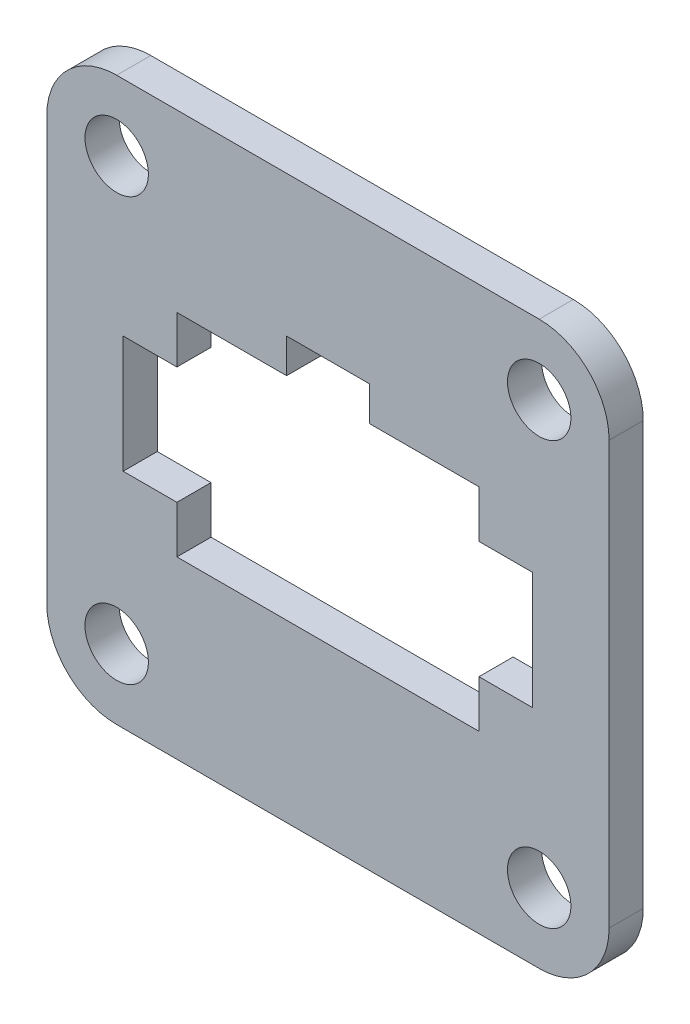
ISO-10303-21;
HEADER;
FILE_DESCRIPTION(('STEP AP214'),'2;1');
FILE_NAME('part.step','',(''),(''),'','','');
FILE_SCHEMA(('AUTOMOTIVE_DESIGN { 1 0 10303 214 1 1 1 1 }'));
ENDSEC;
DATA;
#1=APPLICATION_CONTEXT('core data for automotive mechanical design processes');
#2=APPLICATION_PROTOCOL_DEFINITION('international standard','automotive_design',2000,#1);
#3=PRODUCT_CONTEXT('',#1,'mechanical');
#4=PRODUCT('Part','Part','',(#3));
#5=PRODUCT_RELATED_PRODUCT_CATEGORY('part','',(#4));
#6=PRODUCT_DEFINITION_FORMATION('','',#4);
#7=PRODUCT_DEFINITION_CONTEXT('part definition',#1,'design');
#8=PRODUCT_DEFINITION('design','',#6,#7);
#9=PRODUCT_DEFINITION_SHAPE('','',#8);
#10=(LENGTH_UNIT() NAMED_UNIT(*) SI_UNIT(.MILLI.,.METRE.));
#11=(NAMED_UNIT(*) PLANE_ANGLE_UNIT() SI_UNIT($,.RADIAN.));
#12=(NAMED_UNIT(*) SI_UNIT($,.STERADIAN.) SOLID_ANGLE_UNIT());
#13=UNCERTAINTY_MEASURE_WITH_UNIT(LENGTH_MEASURE(1.E-05),#10,'distance_accuracy_value','');
#14=(GEOMETRIC_REPRESENTATION_CONTEXT(3) GLOBAL_UNCERTAINTY_ASSIGNED_CONTEXT((#13)) GLOBAL_UNIT_ASSIGNED_CONTEXT((#10,
#11,#12)) REPRESENTATION_CONTEXT('',''));
#15=CARTESIAN_POINT('',(0.,0.,0.));
#16=DIRECTION('',(0.,0.,1.));
#17=DIRECTION('',(1.,0.,0.));
#18=AXIS2_PLACEMENT_3D('',#15,#16,#17);
#19=CARTESIAN_POINT('',(-0.0762,0.,1.5875));
#20=DIRECTION('',(1.,0.,0.));
#21=DIRECTION('',(0.,0.,-1.));
#22=AXIS2_PLACEMENT_3D('',#19,#20,#21);
#23=PLANE('',#22);
#24=DIRECTION('',(0.,-1.,0.));
#25=VECTOR('',#24,1.);
#26=CARTESIAN_POINT('',(-0.0762,0.,0.));
#27=LINE('',#26,#25);
#28=CARTESIAN_POINT('',(-0.0762000000000002,22.825,0.));
#29=VERTEX_POINT('',#28);
#30=CARTESIAN_POINT('',(-0.0762,3.175,0.));
#31=VERTEX_POINT('',#30);
#32=EDGE_CURVE('E366',#29,#31,#27,.T.);
#33=ORIENTED_EDGE('',*,*,#32,.T.);
#34=DIRECTION('',(0.,0.,-1.));
#35=VECTOR('',#34,1.);
#36=CARTESIAN_POINT('',(-0.0762,3.175,1.5875));
#37=LINE('',#36,#35);
#38=CARTESIAN_POINT('',(-0.0762,3.175,1.5875));
#39=VERTEX_POINT('',#38);
#40=EDGE_CURVE('E298',#31,#39,#37,.F.);
#41=ORIENTED_EDGE('',*,*,#40,.T.);
#42=DIRECTION('',(0.,-1.,0.));
#43=VECTOR('',#42,1.);
#44=CARTESIAN_POINT('',(-0.0762,0.,1.5875));
#45=LINE('',#44,#43);
#46=CARTESIAN_POINT('',(-0.0762,22.825,1.5875));
#47=VERTEX_POINT('',#46);
#48=EDGE_CURVE('E280',#47,#39,#45,.T.);
#49=ORIENTED_EDGE('',*,*,#48,.F.);
#50=DIRECTION('',(0.,0.,-1.));
#51=VECTOR('',#50,1.);
#52=CARTESIAN_POINT('',(-0.0762,22.825,1.5875));
#53=LINE('',#52,#51);
#54=EDGE_CURVE('E336',#47,#29,#53,.T.);
#55=ORIENTED_EDGE('',*,*,#54,.T.);
#56=EDGE_LOOP('',(#33,#41,#49,#55));
#57=FACE_BOUND('',#56,.T.);
#58=ADVANCED_FACE('F38',(#57),#23,.F.);
#59=CARTESIAN_POINT('',(0.,-0.0762,1.5875));
#60=DIRECTION('',(0.,1.,0.));
#61=DIRECTION('',(0.,0.,1.));
#62=AXIS2_PLACEMENT_3D('',#59,#60,#61);
#63=PLANE('',#62);
#64=DIRECTION('',(1.,0.,0.));
#65=VECTOR('',#64,1.);
#66=CARTESIAN_POINT('',(0.,-0.0762,1.5875));
#67=LINE('',#66,#65);
#68=CARTESIAN_POINT('',(3.175,-0.0762,1.5875));
#69=VERTEX_POINT('',#68);
#70=CARTESIAN_POINT('',(22.825,-0.0762,1.5875));
#71=VERTEX_POINT('',#70);
#72=EDGE_CURVE('E291',#69,#71,#67,.T.);
#73=ORIENTED_EDGE('',*,*,#72,.F.);
#74=DIRECTION('',(0.,0.,1.));
#75=VECTOR('',#74,1.);
#76=CARTESIAN_POINT('',(3.175,-0.0762,1.5875));
#77=LINE('',#76,#75);
#78=CARTESIAN_POINT('',(3.175,-0.0762000000000002,0.));
#79=VERTEX_POINT('',#78);
#80=EDGE_CURVE('E300',#69,#79,#77,.F.);
#81=ORIENTED_EDGE('',*,*,#80,.T.);
#82=DIRECTION('',(1.,0.,0.));
#83=VECTOR('',#82,1.);
#84=CARTESIAN_POINT('',(0.,-0.0762,0.));
#85=LINE('',#84,#83);
#86=CARTESIAN_POINT('',(22.825,-0.0762,0.));
#87=VERTEX_POINT('',#86);
#88=EDGE_CURVE('E363',#79,#87,#85,.T.);
#89=ORIENTED_EDGE('',*,*,#88,.T.);
#90=DIRECTION('',(0.,0.,1.));
#91=VECTOR('',#90,1.);
#92=CARTESIAN_POINT('',(22.825,-0.0762,1.5875));
#93=LINE('',#92,#91);
#94=EDGE_CURVE('E334',#87,#71,#93,.T.);
#95=ORIENTED_EDGE('',*,*,#94,.T.);
#96=EDGE_LOOP('',(#73,#81,#89,#95));
#97=FACE_BOUND('',#96,.T.);
#98=ADVANCED_FACE('F529',(#97),#63,.F.);
#99=CARTESIAN_POINT('',(26.0762,0.,1.5875));
#100=DIRECTION('',(-1.,0.,0.));
#101=DIRECTION('',(0.,0.,1.));
#102=AXIS2_PLACEMENT_3D('',#99,#100,#101);
#103=PLANE('',#102);
#104=DIRECTION('',(0.,1.,0.));
#105=VECTOR('',#104,1.);
#106=CARTESIAN_POINT('',(26.0762,0.,1.5875));
#107=LINE('',#106,#105);
#108=CARTESIAN_POINT('',(26.0762,3.175,1.5875));
#109=VERTEX_POINT('',#108);
#110=CARTESIAN_POINT('',(26.0762,22.825,1.5875));
#111=VERTEX_POINT('',#110);
#112=EDGE_CURVE('E318',#109,#111,#107,.T.);
#113=ORIENTED_EDGE('',*,*,#112,.F.);
#114=DIRECTION('',(0.,0.,1.));
#115=VECTOR('',#114,1.);
#116=CARTESIAN_POINT('',(26.0762,3.175,1.5875));
#117=LINE('',#116,#115);
#118=CARTESIAN_POINT('',(26.0762,3.175,0.));
#119=VERTEX_POINT('',#118);
#120=EDGE_CURVE('E307',#109,#119,#117,.F.);
#121=ORIENTED_EDGE('',*,*,#120,.T.);
#122=DIRECTION('',(0.,1.,0.));
#123=VECTOR('',#122,1.);
#124=CARTESIAN_POINT('',(26.0762,0.,0.));
#125=LINE('',#124,#123);
#126=CARTESIAN_POINT('',(26.0762,22.825,0.));
#127=VERTEX_POINT('',#126);
#128=EDGE_CURVE('E358',#119,#127,#125,.T.);
#129=ORIENTED_EDGE('',*,*,#128,.T.);
#130=DIRECTION('',(0.,0.,1.));
#131=VECTOR('',#130,1.);
#132=CARTESIAN_POINT('',(26.0762,22.825,1.5875));
#133=LINE('',#132,#131);
#134=EDGE_CURVE('E302',#127,#111,#133,.T.);
#135=ORIENTED_EDGE('',*,*,#134,.T.);
#136=EDGE_LOOP('',(#113,#121,#129,#135));
#137=FACE_BOUND('',#136,.T.);
#138=ADVANCED_FACE('F357',(#137),#103,.F.);
#139=CARTESIAN_POINT('',(0.,26.0762,1.5875));
#140=DIRECTION('',(0.,-1.,0.));
#141=DIRECTION('',(0.,0.,-1.));
#142=AXIS2_PLACEMENT_3D('',#139,#140,#141);
#143=PLANE('',#142);
#144=DIRECTION('',(-1.,0.,0.));
#145=VECTOR('',#144,1.);
#146=CARTESIAN_POINT('',(0.,26.0762,1.5875));
#147=LINE('',#146,#145);
#148=CARTESIAN_POINT('',(22.825,26.0762,1.5875));
#149=VERTEX_POINT('',#148);
#150=CARTESIAN_POINT('',(3.175,26.0762,1.5875));
#151=VERTEX_POINT('',#150);
#152=EDGE_CURVE('E329',#149,#151,#147,.T.);
#153=ORIENTED_EDGE('',*,*,#152,.F.);
#154=DIRECTION('',(0.,0.,-1.));
#155=VECTOR('',#154,1.);
#156=CARTESIAN_POINT('',(22.825,26.0762,1.5875));
#157=LINE('',#156,#155);
#158=CARTESIAN_POINT('',(22.825,26.0762,0.));
#159=VERTEX_POINT('',#158);
#160=EDGE_CURVE('E13',#149,#159,#157,.T.);
#161=ORIENTED_EDGE('',*,*,#160,.T.);
#162=DIRECTION('',(-1.,0.,0.));
#163=VECTOR('',#162,1.);
#164=CARTESIAN_POINT('',(0.,26.0762,0.));
#165=LINE('',#164,#163);
#166=CARTESIAN_POINT('',(3.175,26.0762,0.));
#167=VERTEX_POINT('',#166);
#168=EDGE_CURVE('E292',#159,#167,#165,.T.);
#169=ORIENTED_EDGE('',*,*,#168,.T.);
#170=DIRECTION('',(0.,0.,-1.));
#171=VECTOR('',#170,1.);
#172=CARTESIAN_POINT('',(3.175,26.0762,1.5875));
#173=LINE('',#172,#171);
#174=EDGE_CURVE('E48',#167,#151,#173,.F.);
#175=ORIENTED_EDGE('',*,*,#174,.T.);
#176=EDGE_LOOP('',(#153,#161,#169,#175));
#177=FACE_BOUND('',#176,.T.);
#178=ADVANCED_FACE('F264',(#177),#143,.F.);
#179=CARTESIAN_POINT('',(0.,0.,1.5875));
#180=DIRECTION('',(0.,0.,-1.));
#181=DIRECTION('',(-1.,0.,0.));
#182=AXIS2_PLACEMENT_3D('',#179,#180,#181);
#183=PLANE('',#182);
#184=CARTESIAN_POINT('',(3.175,3.175,1.5875));
#185=DIRECTION('',(0.,0.,-1.));
#186=DIRECTION('',(-1.,0.,0.));
#187=AXIS2_PLACEMENT_3D('',#184,#185,#186);
#188=CIRCLE('',#187,1.4738);
#189=CARTESIAN_POINT('',(1.7012,3.175,1.5875));
#190=VERTEX_POINT('',#189);
#191=EDGE_CURVE('E42',#190,#190,#188,.F.);
#192=ORIENTED_EDGE('',*,*,#191,.F.);
#193=EDGE_LOOP('',(#192));
#194=FACE_BOUND('',#193,.T.);
#195=CARTESIAN_POINT('',(22.825,3.175,1.5875));
#196=DIRECTION('',(0.,0.,-1.));
#197=DIRECTION('',(-1.,0.,0.));
#198=AXIS2_PLACEMENT_3D('',#195,#196,#197);
#199=CIRCLE('',#198,1.4738);
#200=CARTESIAN_POINT('',(21.3512,3.175,1.5875));
#201=VERTEX_POINT('',#200);
#202=EDGE_CURVE('E234',#201,#201,#199,.F.);
#203=ORIENTED_EDGE('',*,*,#202,.F.);
#204=EDGE_LOOP('',(#203));
#205=FACE_BOUND('',#204,.T.);
#206=CARTESIAN_POINT('',(22.825,22.825,1.5875));
#207=DIRECTION('',(0.,0.,-1.));
#208=DIRECTION('',(-1.,0.,0.));
#209=AXIS2_PLACEMENT_3D('',#206,#207,#208);
#210=CIRCLE('',#209,1.4738);
#211=CARTESIAN_POINT('',(21.3512,22.825,1.5875));
#212=VERTEX_POINT('',#211);
#213=EDGE_CURVE('E233',#212,#212,#210,.F.);
#214=ORIENTED_EDGE('',*,*,#213,.F.);
#215=EDGE_LOOP('',(#214));
#216=FACE_BOUND('',#215,.T.);
#217=CARTESIAN_POINT('',(3.175,22.825,1.5875));
#218=DIRECTION('',(0.,0.,-1.));
#219=DIRECTION('',(-1.,0.,0.));
#220=AXIS2_PLACEMENT_3D('',#217,#218,#219);
#221=CIRCLE('',#220,1.4738);
#222=CARTESIAN_POINT('',(1.7012,22.825,1.5875));
#223=VERTEX_POINT('',#222);
#224=EDGE_CURVE('E242',#223,#223,#221,.F.);
#225=ORIENTED_EDGE('',*,*,#224,.F.);
#226=EDGE_LOOP('',(#225));
#227=FACE_BOUND('',#226,.T.);
#228=DIRECTION('',(0.,-1.,0.));
#229=VECTOR('',#228,1.);
#230=CARTESIAN_POINT('',(5.9762,15.8,1.5875));
#231=LINE('',#230,#229);
#232=CARTESIAN_POINT('',(5.9762,17.9238,1.5875));
#233=VERTEX_POINT('',#232);
#234=CARTESIAN_POINT('',(5.9762,15.7238,1.5875));
#235=VERTEX_POINT('',#234);
#236=EDGE_CURVE('E277',#233,#235,#231,.T.);
#237=ORIENTED_EDGE('',*,*,#236,.F.);
#238=DIRECTION('',(-1.,0.,0.));
#239=VECTOR('',#238,1.);
#240=CARTESIAN_POINT('',(5.9,17.9238,1.5875));
#241=LINE('',#240,#239);
#242=CARTESIAN_POINT('',(11.0762,17.9238,1.5875));
#243=VERTEX_POINT('',#242);
#244=EDGE_CURVE('E249',#243,#233,#241,.T.);
#245=ORIENTED_EDGE('',*,*,#244,.F.);
#246=DIRECTION('',(0.,-1.,0.));
#247=VECTOR('',#246,1.);
#248=CARTESIAN_POINT('',(11.0762,18.,1.5875));
#249=LINE('',#248,#247);
#250=CARTESIAN_POINT('',(11.0762,19.5238,1.5875));
#251=VERTEX_POINT('',#250);
#252=EDGE_CURVE('E448',#251,#243,#249,.T.);
#253=ORIENTED_EDGE('',*,*,#252,.F.);
#254=DIRECTION('',(-1.,0.,0.));
#255=VECTOR('',#254,1.);
#256=CARTESIAN_POINT('',(11.,19.5238,1.5875));
#257=LINE('',#256,#255);
#258=CARTESIAN_POINT('',(14.9238,19.5238,1.5875));
#259=VERTEX_POINT('',#258);
#260=EDGE_CURVE('E453',#259,#251,#257,.T.);
#261=ORIENTED_EDGE('',*,*,#260,.F.);
#262=DIRECTION('',(0.,1.,0.));
#263=VECTOR('',#262,1.);
#264=CARTESIAN_POINT('',(14.9238,19.6,1.5875));
#265=LINE('',#264,#263);
#266=CARTESIAN_POINT('',(14.9238,17.9238,1.5875));
#267=VERTEX_POINT('',#266);
#268=EDGE_CURVE('E458',#267,#259,#265,.T.);
#269=ORIENTED_EDGE('',*,*,#268,.F.);
#270=DIRECTION('',(-1.,0.,0.));
#271=VECTOR('',#270,1.);
#272=CARTESIAN_POINT('',(15.,17.9238,1.5875));
#273=LINE('',#272,#271);
#274=CARTESIAN_POINT('',(20.0238,17.9238,1.5875));
#275=VERTEX_POINT('',#274);
#276=EDGE_CURVE('E463',#275,#267,#273,.T.);
#277=ORIENTED_EDGE('',*,*,#276,.F.);
#278=DIRECTION('',(0.,1.,0.));
#279=VECTOR('',#278,1.);
#280=CARTESIAN_POINT('',(20.0238,18.,1.5875));
#281=LINE('',#280,#279);
#282=CARTESIAN_POINT('',(20.0238,15.7238,1.5875));
#283=VERTEX_POINT('',#282);
#284=EDGE_CURVE('E469',#283,#275,#281,.T.);
#285=ORIENTED_EDGE('',*,*,#284,.F.);
#286=DIRECTION('',(-1.,0.,0.));
#287=VECTOR('',#286,1.);
#288=CARTESIAN_POINT('',(20.1,15.7238,1.5875));
#289=LINE('',#288,#287);
#290=CARTESIAN_POINT('',(22.5238,15.7238,1.5875));
#291=VERTEX_POINT('',#290);
#292=EDGE_CURVE('E473',#291,#283,#289,.T.);
#293=ORIENTED_EDGE('',*,*,#292,.F.);
#294=DIRECTION('',(0.,1.,0.));
#295=VECTOR('',#294,1.);
#296=CARTESIAN_POINT('',(22.5238,15.8,1.5875));
#297=LINE('',#296,#295);
#298=CARTESIAN_POINT('',(22.5238,10.2762,1.5875));
#299=VERTEX_POINT('',#298);
#300=EDGE_CURVE('E403',#299,#291,#297,.T.);
#301=ORIENTED_EDGE('',*,*,#300,.F.);
#302=DIRECTION('',(1.,0.,0.));
#303=VECTOR('',#302,1.);
#304=CARTESIAN_POINT('',(22.6,10.2762,1.5875));
#305=LINE('',#304,#303);
#306=CARTESIAN_POINT('',(20.0238,10.2762,1.5875));
#307=VERTEX_POINT('',#306);
#308=EDGE_CURVE('E399',#307,#299,#305,.T.);
#309=ORIENTED_EDGE('',*,*,#308,.F.);
#310=DIRECTION('',(0.,1.,0.));
#311=VECTOR('',#310,1.);
#312=CARTESIAN_POINT('',(20.0238,10.2,1.5875));
#313=LINE('',#312,#311);
#314=CARTESIAN_POINT('',(20.0238,8.0762,1.5875));
#315=VERTEX_POINT('',#314);
#316=EDGE_CURVE('E206',#315,#307,#313,.T.);
#317=ORIENTED_EDGE('',*,*,#316,.F.);
#318=DIRECTION('',(1.,0.,0.));
#319=VECTOR('',#318,1.);
#320=CARTESIAN_POINT('',(5.9,8.0762,1.5875));
#321=LINE('',#320,#319);
#322=CARTESIAN_POINT('',(5.9762,8.0762,1.5875));
#323=VERTEX_POINT('',#322);
#324=EDGE_CURVE('E415',#323,#315,#321,.T.);
#325=ORIENTED_EDGE('',*,*,#324,.F.);
#326=DIRECTION('',(0.,-1.,0.));
#327=VECTOR('',#326,1.);
#328=CARTESIAN_POINT('',(5.9762,8.,1.5875));
#329=LINE('',#328,#327);
#330=CARTESIAN_POINT('',(5.9762,10.2762,1.5875));
#331=VERTEX_POINT('',#330);
#332=EDGE_CURVE('E418',#331,#323,#329,.T.);
#333=ORIENTED_EDGE('',*,*,#332,.F.);
#334=DIRECTION('',(1.,0.,0.));
#335=VECTOR('',#334,1.);
#336=CARTESIAN_POINT('',(5.9,10.2762,1.5875));
#337=LINE('',#336,#335);
#338=CARTESIAN_POINT('',(3.4762,10.2762,1.5875));
#339=VERTEX_POINT('',#338);
#340=EDGE_CURVE('E423',#339,#331,#337,.T.);
#341=ORIENTED_EDGE('',*,*,#340,.F.);
#342=DIRECTION('',(0.,-1.,0.));
#343=VECTOR('',#342,1.);
#344=CARTESIAN_POINT('',(3.4762,10.2,1.5875));
#345=LINE('',#344,#343);
#346=CARTESIAN_POINT('',(3.4762,15.7238,1.5875));
#347=VERTEX_POINT('',#346);
#348=EDGE_CURVE('E428',#347,#339,#345,.T.);
#349=ORIENTED_EDGE('',*,*,#348,.F.);
#350=DIRECTION('',(-1.,0.,0.));
#351=VECTOR('',#350,1.);
#352=CARTESIAN_POINT('',(3.4,15.7238,1.5875));
#353=LINE('',#352,#351);
#354=EDGE_CURVE('E432',#235,#347,#353,.T.);
#355=ORIENTED_EDGE('',*,*,#354,.F.);
#356=EDGE_LOOP('',(#237,#245,#253,#261,#269,#277,#285,#293,#301,#309,#317,#325,#333,#341,#349,#355));
#357=FACE_BOUND('',#356,.T.);
#358=ORIENTED_EDGE('',*,*,#48,.T.);
#359=CARTESIAN_POINT('',(3.175,3.175,1.5875));
#360=DIRECTION('',(0.,0.,-1.));
#361=DIRECTION('',(-1.,0.,0.));
#362=AXIS2_PLACEMENT_3D('',#359,#360,#361);
#363=CIRCLE('',#362,3.2512);
#364=EDGE_CURVE('E283',#39,#69,#363,.F.);
#365=ORIENTED_EDGE('',*,*,#364,.T.);
#366=ORIENTED_EDGE('',*,*,#72,.T.);
#367=CARTESIAN_POINT('',(22.825,3.175,1.5875));
#368=DIRECTION('',(0.,0.,-1.));
#369=DIRECTION('',(-1.,0.,0.));
#370=AXIS2_PLACEMENT_3D('',#367,#368,#369);
#371=CIRCLE('',#370,3.2512);
#372=EDGE_CURVE('E303',#71,#109,#371,.F.);
#373=ORIENTED_EDGE('',*,*,#372,.T.);
#374=ORIENTED_EDGE('',*,*,#112,.T.);
#375=CARTESIAN_POINT('',(22.825,22.825,1.5875));
#376=DIRECTION('',(0.,0.,-1.));
#377=DIRECTION('',(-1.,0.,0.));
#378=AXIS2_PLACEMENT_3D('',#375,#376,#377);
#379=CIRCLE('',#378,3.2512);
#380=EDGE_CURVE('E311',#111,#149,#379,.F.);
#381=ORIENTED_EDGE('',*,*,#380,.T.);
#382=ORIENTED_EDGE('',*,*,#152,.T.);
#383=CARTESIAN_POINT('',(3.175,22.825,1.5875));
#384=DIRECTION('',(0.,0.,-1.));
#385=DIRECTION('',(-1.,0.,0.));
#386=AXIS2_PLACEMENT_3D('',#383,#384,#385);
#387=CIRCLE('',#386,3.2512);
#388=EDGE_CURVE('E286',#151,#47,#387,.F.);
#389=ORIENTED_EDGE('',*,*,#388,.T.);
#390=EDGE_LOOP('',(#358,#365,#366,#373,#374,#381,#382,#389));
#391=FACE_BOUND('',#390,.T.);
#392=ADVANCED_FACE('F261',(#194,#205,#216,#227,#357,#391),#183,.F.);
#393=CARTESIAN_POINT('',(0.,0.,0.));
#394=DIRECTION('',(0.,0.,-1.));
#395=DIRECTION('',(-1.,0.,0.));
#396=AXIS2_PLACEMENT_3D('',#393,#394,#395);
#397=PLANE('',#396);
#398=CARTESIAN_POINT('',(3.175,3.175,0.));
#399=DIRECTION('',(0.,0.,-1.));
#400=DIRECTION('',(-1.,0.,0.));
#401=AXIS2_PLACEMENT_3D('',#398,#399,#400);
#402=CIRCLE('',#401,1.4738);
#403=CARTESIAN_POINT('',(1.7012,3.175,0.));
#404=VERTEX_POINT('',#403);
#405=EDGE_CURVE('E238',#404,#404,#402,.F.);
#406=ORIENTED_EDGE('',*,*,#405,.T.);
#407=EDGE_LOOP('',(#406));
#408=FACE_BOUND('',#407,.T.);
#409=CARTESIAN_POINT('',(22.825,3.175,0.));
#410=DIRECTION('',(0.,0.,-1.));
#411=DIRECTION('',(-1.,0.,0.));
#412=AXIS2_PLACEMENT_3D('',#409,#410,#411);
#413=CIRCLE('',#412,1.4738);
#414=CARTESIAN_POINT('',(21.3512,3.175,0.));
#415=VERTEX_POINT('',#414);
#416=EDGE_CURVE('E230',#415,#415,#413,.F.);
#417=ORIENTED_EDGE('',*,*,#416,.T.);
#418=EDGE_LOOP('',(#417));
#419=FACE_BOUND('',#418,.T.);
#420=CARTESIAN_POINT('',(22.825,22.825,0.));
#421=DIRECTION('',(0.,0.,-1.));
#422=DIRECTION('',(-1.,0.,0.));
#423=AXIS2_PLACEMENT_3D('',#420,#421,#422);
#424=CIRCLE('',#423,1.4738);
#425=CARTESIAN_POINT('',(21.3512,22.825,0.));
#426=VERTEX_POINT('',#425);
#427=EDGE_CURVE('E239',#426,#426,#424,.F.);
#428=ORIENTED_EDGE('',*,*,#427,.T.);
#429=EDGE_LOOP('',(#428));
#430=FACE_BOUND('',#429,.T.);
#431=CARTESIAN_POINT('',(3.175,22.825,0.));
#432=DIRECTION('',(0.,0.,-1.));
#433=DIRECTION('',(-1.,0.,0.));
#434=AXIS2_PLACEMENT_3D('',#431,#432,#433);
#435=CIRCLE('',#434,1.4738);
#436=CARTESIAN_POINT('',(1.7012,22.825,0.));
#437=VERTEX_POINT('',#436);
#438=EDGE_CURVE('E246',#437,#437,#435,.F.);
#439=ORIENTED_EDGE('',*,*,#438,.T.);
#440=EDGE_LOOP('',(#439));
#441=FACE_BOUND('',#440,.T.);
#442=DIRECTION('',(-1.,0.,0.));
#443=VECTOR('',#442,1.);
#444=CARTESIAN_POINT('',(5.9,17.9238,0.));
#445=LINE('',#444,#443);
#446=CARTESIAN_POINT('',(11.0762,17.9238,0.));
#447=VERTEX_POINT('',#446);
#448=CARTESIAN_POINT('',(5.9762,17.9238,0.));
#449=VERTEX_POINT('',#448);
#450=EDGE_CURVE('E452',#447,#449,#445,.T.);
#451=ORIENTED_EDGE('',*,*,#450,.T.);
#452=DIRECTION('',(0.,-1.,0.));
#453=VECTOR('',#452,1.);
#454=CARTESIAN_POINT('',(5.9762,15.8,0.));
#455=LINE('',#454,#453);
#456=CARTESIAN_POINT('',(5.9762,15.7238,0.));
#457=VERTEX_POINT('',#456);
#458=EDGE_CURVE('E500',#449,#457,#455,.T.);
#459=ORIENTED_EDGE('',*,*,#458,.T.);
#460=DIRECTION('',(-1.,0.,0.));
#461=VECTOR('',#460,1.);
#462=CARTESIAN_POINT('',(3.4,15.7238,0.));
#463=LINE('',#462,#461);
#464=CARTESIAN_POINT('',(3.4762,15.7238,0.));
#465=VERTEX_POINT('',#464);
#466=EDGE_CURVE('E503',#457,#465,#463,.T.);
#467=ORIENTED_EDGE('',*,*,#466,.T.);
#468=DIRECTION('',(0.,-1.,0.));
#469=VECTOR('',#468,1.);
#470=CARTESIAN_POINT('',(3.4762,10.2,0.));
#471=LINE('',#470,#469);
#472=CARTESIAN_POINT('',(3.4762,10.2762,0.));
#473=VERTEX_POINT('',#472);
#474=EDGE_CURVE('E506',#465,#473,#471,.T.);
#475=ORIENTED_EDGE('',*,*,#474,.T.);
#476=DIRECTION('',(1.,0.,0.));
#477=VECTOR('',#476,1.);
#478=CARTESIAN_POINT('',(5.9,10.2762,0.));
#479=LINE('',#478,#477);
#480=CARTESIAN_POINT('',(5.9762,10.2762,0.));
#481=VERTEX_POINT('',#480);
#482=EDGE_CURVE('E509',#473,#481,#479,.T.);
#483=ORIENTED_EDGE('',*,*,#482,.T.);
#484=DIRECTION('',(0.,-1.,0.));
#485=VECTOR('',#484,1.);
#486=CARTESIAN_POINT('',(5.9762,8.,0.));
#487=LINE('',#486,#485);
#488=CARTESIAN_POINT('',(5.9762,8.0762,0.));
#489=VERTEX_POINT('',#488);
#490=EDGE_CURVE('E226',#481,#489,#487,.T.);
#491=ORIENTED_EDGE('',*,*,#490,.T.);
#492=DIRECTION('',(1.,0.,0.));
#493=VECTOR('',#492,1.);
#494=CARTESIAN_POINT('',(5.9,8.0762,0.));
#495=LINE('',#494,#493);
#496=CARTESIAN_POINT('',(20.0238,8.0762,0.));
#497=VERTEX_POINT('',#496);
#498=EDGE_CURVE('E224',#489,#497,#495,.T.);
#499=ORIENTED_EDGE('',*,*,#498,.T.);
#500=DIRECTION('',(0.,1.,0.));
#501=VECTOR('',#500,1.);
#502=CARTESIAN_POINT('',(20.0238,10.2,0.));
#503=LINE('',#502,#501);
#504=CARTESIAN_POINT('',(20.0238,10.2762,0.));
#505=VERTEX_POINT('',#504);
#506=EDGE_CURVE('E203',#497,#505,#503,.T.);
#507=ORIENTED_EDGE('',*,*,#506,.T.);
#508=DIRECTION('',(1.,0.,0.));
#509=VECTOR('',#508,1.);
#510=CARTESIAN_POINT('',(22.6,10.2762,0.));
#511=LINE('',#510,#509);
#512=CARTESIAN_POINT('',(22.5238,10.2762,0.));
#513=VERTEX_POINT('',#512);
#514=EDGE_CURVE('E213',#505,#513,#511,.T.);
#515=ORIENTED_EDGE('',*,*,#514,.T.);
#516=DIRECTION('',(0.,1.,0.));
#517=VECTOR('',#516,1.);
#518=CARTESIAN_POINT('',(22.5238,15.8,0.));
#519=LINE('',#518,#517);
#520=CARTESIAN_POINT('',(22.5238,15.7238,0.));
#521=VERTEX_POINT('',#520);
#522=EDGE_CURVE('E218',#513,#521,#519,.T.);
#523=ORIENTED_EDGE('',*,*,#522,.T.);
#524=DIRECTION('',(-1.,0.,0.));
#525=VECTOR('',#524,1.);
#526=CARTESIAN_POINT('',(20.1,15.7238,0.));
#527=LINE('',#526,#525);
#528=CARTESIAN_POINT('',(20.0238,15.7238,0.));
#529=VERTEX_POINT('',#528);
#530=EDGE_CURVE('E482',#521,#529,#527,.T.);
#531=ORIENTED_EDGE('',*,*,#530,.T.);
#532=DIRECTION('',(0.,1.,0.));
#533=VECTOR('',#532,1.);
#534=CARTESIAN_POINT('',(20.0238,18.,0.));
#535=LINE('',#534,#533);
#536=CARTESIAN_POINT('',(20.0238,17.9238,0.));
#537=VERTEX_POINT('',#536);
#538=EDGE_CURVE('E485',#529,#537,#535,.T.);
#539=ORIENTED_EDGE('',*,*,#538,.T.);
#540=DIRECTION('',(-1.,0.,0.));
#541=VECTOR('',#540,1.);
#542=CARTESIAN_POINT('',(15.,17.9238,0.));
#543=LINE('',#542,#541);
#544=CARTESIAN_POINT('',(14.9238,17.9238,0.));
#545=VERTEX_POINT('',#544);
#546=EDGE_CURVE('E488',#537,#545,#543,.T.);
#547=ORIENTED_EDGE('',*,*,#546,.T.);
#548=DIRECTION('',(0.,1.,0.));
#549=VECTOR('',#548,1.);
#550=CARTESIAN_POINT('',(14.9238,19.6,0.));
#551=LINE('',#550,#549);
#552=CARTESIAN_POINT('',(14.9238,19.5238,0.));
#553=VERTEX_POINT('',#552);
#554=EDGE_CURVE('E491',#545,#553,#551,.T.);
#555=ORIENTED_EDGE('',*,*,#554,.T.);
#556=DIRECTION('',(-1.,0.,0.));
#557=VECTOR('',#556,1.);
#558=CARTESIAN_POINT('',(11.,19.5238,0.));
#559=LINE('',#558,#557);
#560=CARTESIAN_POINT('',(11.0762,19.5238,0.));
#561=VERTEX_POINT('',#560);
#562=EDGE_CURVE('E494',#553,#561,#559,.T.);
#563=ORIENTED_EDGE('',*,*,#562,.T.);
#564=DIRECTION('',(0.,-1.,0.));
#565=VECTOR('',#564,1.);
#566=CARTESIAN_POINT('',(11.0762,18.,0.));
#567=LINE('',#566,#565);
#568=EDGE_CURVE('E385',#561,#447,#567,.T.);
#569=ORIENTED_EDGE('',*,*,#568,.T.);
#570=EDGE_LOOP('',(#451,#459,#467,#475,#483,#491,#499,#507,#515,#523,#531,#539,#547,#555,#563,#569));
#571=FACE_BOUND('',#570,.T.);
#572=ORIENTED_EDGE('',*,*,#88,.F.);
#573=CARTESIAN_POINT('',(3.175,3.175,0.));
#574=DIRECTION('',(0.,0.,-1.));
#575=DIRECTION('',(-1.,0.,0.));
#576=AXIS2_PLACEMENT_3D('',#573,#574,#575);
#577=CIRCLE('',#576,3.2512);
#578=EDGE_CURVE('E339',#79,#31,#577,.T.);
#579=ORIENTED_EDGE('',*,*,#578,.T.);
#580=ORIENTED_EDGE('',*,*,#32,.F.);
#581=CARTESIAN_POINT('',(3.175,22.825,0.));
#582=DIRECTION('',(0.,0.,-1.));
#583=DIRECTION('',(-1.,0.,0.));
#584=AXIS2_PLACEMENT_3D('',#581,#582,#583);
#585=CIRCLE('',#584,3.2512);
#586=EDGE_CURVE('E342',#29,#167,#585,.T.);
#587=ORIENTED_EDGE('',*,*,#586,.T.);
#588=ORIENTED_EDGE('',*,*,#168,.F.);
#589=CARTESIAN_POINT('',(22.825,22.825,0.));
#590=DIRECTION('',(0.,0.,-1.));
#591=DIRECTION('',(-1.,0.,0.));
#592=AXIS2_PLACEMENT_3D('',#589,#590,#591);
#593=CIRCLE('',#592,3.2512);
#594=EDGE_CURVE('E346',#159,#127,#593,.T.);
#595=ORIENTED_EDGE('',*,*,#594,.T.);
#596=ORIENTED_EDGE('',*,*,#128,.F.);
#597=CARTESIAN_POINT('',(22.825,3.175,0.));
#598=DIRECTION('',(0.,0.,-1.));
#599=DIRECTION('',(-1.,0.,0.));
#600=AXIS2_PLACEMENT_3D('',#597,#598,#599);
#601=CIRCLE('',#600,3.2512);
#602=EDGE_CURVE('E319',#119,#87,#601,.T.);
#603=ORIENTED_EDGE('',*,*,#602,.T.);
#604=EDGE_LOOP('',(#572,#579,#580,#587,#588,#595,#596,#603));
#605=FACE_BOUND('',#604,.T.);
#606=ADVANCED_FACE('F221',(#408,#419,#430,#441,#571,#605),#397,.T.);
#607=CARTESIAN_POINT('',(5.9,17.9238,0.));
#608=DIRECTION('',(0.,1.,0.));
#609=DIRECTION('',(0.,0.,1.));
#610=AXIS2_PLACEMENT_3D('',#607,#608,#609);
#611=PLANE('',#610);
#612=ORIENTED_EDGE('',*,*,#244,.T.);
#613=DIRECTION('',(0.,0.,1.));
#614=VECTOR('',#613,1.);
#615=CARTESIAN_POINT('',(5.9762,17.9238,0.));
#616=LINE('',#615,#614);
#617=EDGE_CURVE('E382',#449,#233,#616,.T.);
#618=ORIENTED_EDGE('',*,*,#617,.F.);
#619=ORIENTED_EDGE('',*,*,#450,.F.);
#620=DIRECTION('',(0.,0.,1.));
#621=VECTOR('',#620,1.);
#622=CARTESIAN_POINT('',(11.0762,17.9238,0.));
#623=LINE('',#622,#621);
#624=EDGE_CURVE('E386',#447,#243,#623,.T.);
#625=ORIENTED_EDGE('',*,*,#624,.T.);
#626=EDGE_LOOP('',(#612,#618,#619,#625));
#627=FACE_BOUND('',#626,.T.);
#628=ADVANCED_FACE('F574',(#627),#611,.F.);
#629=CARTESIAN_POINT('',(11.0762,18.,0.));
#630=DIRECTION('',(-1.,0.,0.));
#631=DIRECTION('',(0.,0.,1.));
#632=AXIS2_PLACEMENT_3D('',#629,#630,#631);
#633=PLANE('',#632);
#634=ORIENTED_EDGE('',*,*,#252,.T.);
#635=ORIENTED_EDGE('',*,*,#624,.F.);
#636=ORIENTED_EDGE('',*,*,#568,.F.);
#637=DIRECTION('',(0.,0.,1.));
#638=VECTOR('',#637,1.);
#639=CARTESIAN_POINT('',(11.0762,19.5238,0.));
#640=LINE('',#639,#638);
#641=EDGE_CURVE('E388',#561,#251,#640,.T.);
#642=ORIENTED_EDGE('',*,*,#641,.T.);
#643=EDGE_LOOP('',(#634,#635,#636,#642));
#644=FACE_BOUND('',#643,.T.);
#645=ADVANCED_FACE('F571',(#644),#633,.F.);
#646=CARTESIAN_POINT('',(11.,19.5238,0.));
#647=DIRECTION('',(0.,1.,0.));
#648=DIRECTION('',(0.,0.,1.));
#649=AXIS2_PLACEMENT_3D('',#646,#647,#648);
#650=PLANE('',#649);
#651=ORIENTED_EDGE('',*,*,#260,.T.);
#652=ORIENTED_EDGE('',*,*,#641,.F.);
#653=ORIENTED_EDGE('',*,*,#562,.F.);
#654=DIRECTION('',(0.,0.,1.));
#655=VECTOR('',#654,1.);
#656=CARTESIAN_POINT('',(14.9238,19.5238,0.));
#657=LINE('',#656,#655);
#658=EDGE_CURVE('E390',#553,#259,#657,.T.);
#659=ORIENTED_EDGE('',*,*,#658,.T.);
#660=EDGE_LOOP('',(#651,#652,#653,#659));
#661=FACE_BOUND('',#660,.T.);
#662=ADVANCED_FACE('F573',(#661),#650,.F.);
#663=CARTESIAN_POINT('',(14.9238,19.6,0.));
#664=DIRECTION('',(1.,0.,0.));
#665=DIRECTION('',(0.,0.,-1.));
#666=AXIS2_PLACEMENT_3D('',#663,#664,#665);
#667=PLANE('',#666);
#668=ORIENTED_EDGE('',*,*,#268,.T.);
#669=ORIENTED_EDGE('',*,*,#658,.F.);
#670=ORIENTED_EDGE('',*,*,#554,.F.);
#671=DIRECTION('',(0.,0.,1.));
#672=VECTOR('',#671,1.);
#673=CARTESIAN_POINT('',(14.9238,17.9238,0.));
#674=LINE('',#673,#672);
#675=EDGE_CURVE('E392',#545,#267,#674,.T.);
#676=ORIENTED_EDGE('',*,*,#675,.T.);
#677=EDGE_LOOP('',(#668,#669,#670,#676));
#678=FACE_BOUND('',#677,.T.);
#679=ADVANCED_FACE('F580',(#678),#667,.F.);
#680=CARTESIAN_POINT('',(15.,17.9238,0.));
#681=DIRECTION('',(0.,1.,0.));
#682=DIRECTION('',(0.,0.,1.));
#683=AXIS2_PLACEMENT_3D('',#680,#681,#682);
#684=PLANE('',#683);
#685=ORIENTED_EDGE('',*,*,#276,.T.);
#686=ORIENTED_EDGE('',*,*,#675,.F.);
#687=ORIENTED_EDGE('',*,*,#546,.F.);
#688=DIRECTION('',(0.,0.,1.));
#689=VECTOR('',#688,1.);
#690=CARTESIAN_POINT('',(20.0238,17.9238,0.));
#691=LINE('',#690,#689);
#692=EDGE_CURVE('E394',#537,#275,#691,.T.);
#693=ORIENTED_EDGE('',*,*,#692,.T.);
#694=EDGE_LOOP('',(#685,#686,#687,#693));
#695=FACE_BOUND('',#694,.T.);
#696=ADVANCED_FACE('F609',(#695),#684,.F.);
#697=CARTESIAN_POINT('',(20.0238,18.,0.));
#698=DIRECTION('',(1.,0.,0.));
#699=DIRECTION('',(0.,0.,-1.));
#700=AXIS2_PLACEMENT_3D('',#697,#698,#699);
#701=PLANE('',#700);
#702=ORIENTED_EDGE('',*,*,#284,.T.);
#703=ORIENTED_EDGE('',*,*,#692,.F.);
#704=ORIENTED_EDGE('',*,*,#538,.F.);
#705=DIRECTION('',(0.,0.,1.));
#706=VECTOR('',#705,1.);
#707=CARTESIAN_POINT('',(20.0238,15.7238,0.));
#708=LINE('',#707,#706);
#709=EDGE_CURVE('E396',#529,#283,#708,.T.);
#710=ORIENTED_EDGE('',*,*,#709,.T.);
#711=EDGE_LOOP('',(#702,#703,#704,#710));
#712=FACE_BOUND('',#711,.T.);
#713=ADVANCED_FACE('F612',(#712),#701,.F.);
#714=CARTESIAN_POINT('',(20.1,15.7238,0.));
#715=DIRECTION('',(0.,1.,0.));
#716=DIRECTION('',(0.,0.,1.));
#717=AXIS2_PLACEMENT_3D('',#714,#715,#716);
#718=PLANE('',#717);
#719=ORIENTED_EDGE('',*,*,#292,.T.);
#720=ORIENTED_EDGE('',*,*,#709,.F.);
#721=ORIENTED_EDGE('',*,*,#530,.F.);
#722=DIRECTION('',(0.,0.,1.));
#723=VECTOR('',#722,1.);
#724=CARTESIAN_POINT('',(22.5238,15.7238,0.));
#725=LINE('',#724,#723);
#726=EDGE_CURVE('E369',#521,#291,#725,.T.);
#727=ORIENTED_EDGE('',*,*,#726,.T.);
#728=EDGE_LOOP('',(#719,#720,#721,#727));
#729=FACE_BOUND('',#728,.T.);
#730=ADVANCED_FACE('F40',(#729),#718,.F.);
#731=CARTESIAN_POINT('',(22.5238,15.8,0.));
#732=DIRECTION('',(1.,0.,0.));
#733=DIRECTION('',(0.,0.,-1.));
#734=AXIS2_PLACEMENT_3D('',#731,#732,#733);
#735=PLANE('',#734);
#736=ORIENTED_EDGE('',*,*,#300,.T.);
#737=ORIENTED_EDGE('',*,*,#726,.F.);
#738=ORIENTED_EDGE('',*,*,#522,.F.);
#739=DIRECTION('',(0.,0.,1.));
#740=VECTOR('',#739,1.);
#741=CARTESIAN_POINT('',(22.5238,10.2762,0.));
#742=LINE('',#741,#740);
#743=EDGE_CURVE('E210',#513,#299,#742,.T.);
#744=ORIENTED_EDGE('',*,*,#743,.T.);
#745=EDGE_LOOP('',(#736,#737,#738,#744));
#746=FACE_BOUND('',#745,.T.);
#747=ADVANCED_FACE('F560',(#746),#735,.F.);
#748=CARTESIAN_POINT('',(22.6,10.2762,0.));
#749=DIRECTION('',(0.,-1.,0.));
#750=DIRECTION('',(0.,0.,-1.));
#751=AXIS2_PLACEMENT_3D('',#748,#749,#750);
#752=PLANE('',#751);
#753=ORIENTED_EDGE('',*,*,#308,.T.);
#754=ORIENTED_EDGE('',*,*,#743,.F.);
#755=ORIENTED_EDGE('',*,*,#514,.F.);
#756=DIRECTION('',(0.,0.,1.));
#757=VECTOR('',#756,1.);
#758=CARTESIAN_POINT('',(20.0238,10.2762,0.));
#759=LINE('',#758,#757);
#760=EDGE_CURVE('E199',#505,#307,#759,.T.);
#761=ORIENTED_EDGE('',*,*,#760,.T.);
#762=EDGE_LOOP('',(#753,#754,#755,#761));
#763=FACE_BOUND('',#762,.T.);
#764=ADVANCED_FACE('F214',(#763),#752,.F.);
#765=CARTESIAN_POINT('',(20.0238,10.2,0.));
#766=DIRECTION('',(1.,0.,0.));
#767=DIRECTION('',(0.,0.,-1.));
#768=AXIS2_PLACEMENT_3D('',#765,#766,#767);
#769=PLANE('',#768);
#770=ORIENTED_EDGE('',*,*,#316,.T.);
#771=ORIENTED_EDGE('',*,*,#760,.F.);
#772=ORIENTED_EDGE('',*,*,#506,.F.);
#773=DIRECTION('',(0.,0.,1.));
#774=VECTOR('',#773,1.);
#775=CARTESIAN_POINT('',(20.0238,8.0762,0.));
#776=LINE('',#775,#774);
#777=EDGE_CURVE('E194',#497,#315,#776,.T.);
#778=ORIENTED_EDGE('',*,*,#777,.T.);
#779=EDGE_LOOP('',(#770,#771,#772,#778));
#780=FACE_BOUND('',#779,.T.);
#781=ADVANCED_FACE('F201',(#780),#769,.F.);
#782=CARTESIAN_POINT('',(5.9,8.0762,0.));
#783=DIRECTION('',(0.,-1.,0.));
#784=DIRECTION('',(0.,0.,-1.));
#785=AXIS2_PLACEMENT_3D('',#782,#783,#784);
#786=PLANE('',#785);
#787=ORIENTED_EDGE('',*,*,#324,.T.);
#788=ORIENTED_EDGE('',*,*,#777,.F.);
#789=ORIENTED_EDGE('',*,*,#498,.F.);
#790=DIRECTION('',(0.,0.,1.));
#791=VECTOR('',#790,1.);
#792=CARTESIAN_POINT('',(5.9762,8.0762,0.));
#793=LINE('',#792,#791);
#794=EDGE_CURVE('E372',#489,#323,#793,.T.);
#795=ORIENTED_EDGE('',*,*,#794,.T.);
#796=EDGE_LOOP('',(#787,#788,#789,#795));
#797=FACE_BOUND('',#796,.T.);
#798=ADVANCED_FACE('F517',(#797),#786,.F.);
#799=CARTESIAN_POINT('',(5.9762,8.,0.));
#800=DIRECTION('',(-1.,0.,0.));
#801=DIRECTION('',(0.,-1.,0.));
#802=AXIS2_PLACEMENT_3D('',#799,#800,#801);
#803=PLANE('',#802);
#804=ORIENTED_EDGE('',*,*,#332,.T.);
#805=ORIENTED_EDGE('',*,*,#794,.F.);
#806=ORIENTED_EDGE('',*,*,#490,.F.);
#807=DIRECTION('',(0.,0.,1.));
#808=VECTOR('',#807,1.);
#809=CARTESIAN_POINT('',(5.9762,10.2762,0.));
#810=LINE('',#809,#808);
#811=EDGE_CURVE('E374',#481,#331,#810,.T.);
#812=ORIENTED_EDGE('',*,*,#811,.T.);
#813=EDGE_LOOP('',(#804,#805,#806,#812));
#814=FACE_BOUND('',#813,.T.);
#815=ADVANCED_FACE('F514',(#814),#803,.F.);
#816=CARTESIAN_POINT('',(5.9,10.2762,0.));
#817=DIRECTION('',(0.,-1.,0.));
#818=DIRECTION('',(0.,0.,-1.));
#819=AXIS2_PLACEMENT_3D('',#816,#817,#818);
#820=PLANE('',#819);
#821=ORIENTED_EDGE('',*,*,#340,.T.);
#822=ORIENTED_EDGE('',*,*,#811,.F.);
#823=ORIENTED_EDGE('',*,*,#482,.F.);
#824=DIRECTION('',(0.,0.,1.));
#825=VECTOR('',#824,1.);
#826=CARTESIAN_POINT('',(3.4762,10.2762,0.));
#827=LINE('',#826,#825);
#828=EDGE_CURVE('E376',#473,#339,#827,.T.);
#829=ORIENTED_EDGE('',*,*,#828,.T.);
#830=EDGE_LOOP('',(#821,#822,#823,#829));
#831=FACE_BOUND('',#830,.T.);
#832=ADVANCED_FACE('F524',(#831),#820,.F.);
#833=CARTESIAN_POINT('',(3.4762,10.2,0.));
#834=DIRECTION('',(-1.,0.,0.));
#835=DIRECTION('',(0.,-1.,0.));
#836=AXIS2_PLACEMENT_3D('',#833,#834,#835);
#837=PLANE('',#836);
#838=ORIENTED_EDGE('',*,*,#348,.T.);
#839=ORIENTED_EDGE('',*,*,#828,.F.);
#840=ORIENTED_EDGE('',*,*,#474,.F.);
#841=DIRECTION('',(0.,0.,1.));
#842=VECTOR('',#841,1.);
#843=CARTESIAN_POINT('',(3.4762,15.7238,0.));
#844=LINE('',#843,#842);
#845=EDGE_CURVE('E378',#465,#347,#844,.T.);
#846=ORIENTED_EDGE('',*,*,#845,.T.);
#847=EDGE_LOOP('',(#838,#839,#840,#846));
#848=FACE_BOUND('',#847,.T.);
#849=ADVANCED_FACE('F562',(#848),#837,.F.);
#850=CARTESIAN_POINT('',(3.4,15.7238,0.));
#851=DIRECTION('',(0.,1.,0.));
#852=DIRECTION('',(0.,0.,1.));
#853=AXIS2_PLACEMENT_3D('',#850,#851,#852);
#854=PLANE('',#853);
#855=ORIENTED_EDGE('',*,*,#354,.T.);
#856=ORIENTED_EDGE('',*,*,#845,.F.);
#857=ORIENTED_EDGE('',*,*,#466,.F.);
#858=DIRECTION('',(0.,0.,1.));
#859=VECTOR('',#858,1.);
#860=CARTESIAN_POINT('',(5.9762,15.7238,0.));
#861=LINE('',#860,#859);
#862=EDGE_CURVE('E380',#457,#235,#861,.T.);
#863=ORIENTED_EDGE('',*,*,#862,.T.);
#864=EDGE_LOOP('',(#855,#856,#857,#863));
#865=FACE_BOUND('',#864,.T.);
#866=ADVANCED_FACE('F567',(#865),#854,.F.);
#867=CARTESIAN_POINT('',(5.9762,15.8,0.));
#868=DIRECTION('',(-1.,0.,0.));
#869=DIRECTION('',(0.,0.,1.));
#870=AXIS2_PLACEMENT_3D('',#867,#868,#869);
#871=PLANE('',#870);
#872=ORIENTED_EDGE('',*,*,#236,.T.);
#873=ORIENTED_EDGE('',*,*,#862,.F.);
#874=ORIENTED_EDGE('',*,*,#458,.F.);
#875=ORIENTED_EDGE('',*,*,#617,.T.);
#876=EDGE_LOOP('',(#872,#873,#874,#875));
#877=FACE_BOUND('',#876,.T.);
#878=ADVANCED_FACE('F542',(#877),#871,.F.);
#879=CARTESIAN_POINT('',(3.175,3.175,1.5875));
#880=DIRECTION('',(0.,0.,-1.));
#881=DIRECTION('',(-1.,0.,0.));
#882=AXIS2_PLACEMENT_3D('',#879,#880,#881);
#883=CYLINDRICAL_SURFACE('',#882,3.2512);
#884=ORIENTED_EDGE('',*,*,#364,.F.);
#885=ORIENTED_EDGE('',*,*,#40,.F.);
#886=ORIENTED_EDGE('',*,*,#578,.F.);
#887=ORIENTED_EDGE('',*,*,#80,.F.);
#888=EDGE_LOOP('',(#884,#885,#886,#887));
#889=FACE_BOUND('',#888,.T.);
#890=ADVANCED_FACE('F297',(#889),#883,.T.);
#891=CARTESIAN_POINT('',(22.825,3.175,1.5875));
#892=DIRECTION('',(0.,0.,-1.));
#893=DIRECTION('',(-1.,0.,0.));
#894=AXIS2_PLACEMENT_3D('',#891,#892,#893);
#895=CYLINDRICAL_SURFACE('',#894,3.2512);
#896=ORIENTED_EDGE('',*,*,#372,.F.);
#897=ORIENTED_EDGE('',*,*,#94,.F.);
#898=ORIENTED_EDGE('',*,*,#602,.F.);
#899=ORIENTED_EDGE('',*,*,#120,.F.);
#900=EDGE_LOOP('',(#896,#897,#898,#899));
#901=FACE_BOUND('',#900,.T.);
#902=ADVANCED_FACE('F541',(#901),#895,.T.);
#903=CARTESIAN_POINT('',(22.825,22.825,1.5875));
#904=DIRECTION('',(0.,0.,-1.));
#905=DIRECTION('',(-1.,0.,0.));
#906=AXIS2_PLACEMENT_3D('',#903,#904,#905);
#907=CYLINDRICAL_SURFACE('',#906,3.2512);
#908=ORIENTED_EDGE('',*,*,#380,.F.);
#909=ORIENTED_EDGE('',*,*,#134,.F.);
#910=ORIENTED_EDGE('',*,*,#594,.F.);
#911=ORIENTED_EDGE('',*,*,#160,.F.);
#912=EDGE_LOOP('',(#908,#909,#910,#911));
#913=FACE_BOUND('',#912,.T.);
#914=ADVANCED_FACE('F707',(#913),#907,.T.);
#915=CARTESIAN_POINT('',(3.175,22.825,1.5875));
#916=DIRECTION('',(0.,0.,-1.));
#917=DIRECTION('',(-1.,0.,0.));
#918=AXIS2_PLACEMENT_3D('',#915,#916,#917);
#919=CYLINDRICAL_SURFACE('',#918,3.2512);
#920=ORIENTED_EDGE('',*,*,#388,.F.);
#921=ORIENTED_EDGE('',*,*,#174,.F.);
#922=ORIENTED_EDGE('',*,*,#586,.F.);
#923=ORIENTED_EDGE('',*,*,#54,.F.);
#924=EDGE_LOOP('',(#920,#921,#922,#923));
#925=FACE_BOUND('',#924,.T.);
#926=ADVANCED_FACE('F536',(#925),#919,.T.);
#927=CARTESIAN_POINT('',(3.175,22.825,0.));
#928=DIRECTION('',(0.,0.,1.));
#929=DIRECTION('',(1.,0.,0.));
#930=AXIS2_PLACEMENT_3D('',#927,#928,#929);
#931=CYLINDRICAL_SURFACE('',#930,1.4738);
#932=ORIENTED_EDGE('',*,*,#438,.F.);
#933=EDGE_LOOP('',(#932));
#934=FACE_BOUND('',#933,.T.);
#935=ORIENTED_EDGE('',*,*,#224,.T.);
#936=EDGE_LOOP('',(#935));
#937=FACE_BOUND('',#936,.T.);
#938=ADVANCED_FACE('F547',(#934,#937),#931,.F.);
#939=CARTESIAN_POINT('',(22.825,22.825,0.));
#940=DIRECTION('',(0.,0.,1.));
#941=DIRECTION('',(1.,0.,0.));
#942=AXIS2_PLACEMENT_3D('',#939,#940,#941);
#943=CYLINDRICAL_SURFACE('',#942,1.4738);
#944=ORIENTED_EDGE('',*,*,#427,.F.);
#945=EDGE_LOOP('',(#944));
#946=FACE_BOUND('',#945,.T.);
#947=ORIENTED_EDGE('',*,*,#213,.T.);
#948=EDGE_LOOP('',(#947));
#949=FACE_BOUND('',#948,.T.);
#950=ADVANCED_FACE('F550',(#946,#949),#943,.F.);
#951=CARTESIAN_POINT('',(22.825,3.175,0.));
#952=DIRECTION('',(0.,0.,1.));
#953=DIRECTION('',(1.,0.,0.));
#954=AXIS2_PLACEMENT_3D('',#951,#952,#953);
#955=CYLINDRICAL_SURFACE('',#954,1.4738);
#956=ORIENTED_EDGE('',*,*,#416,.F.);
#957=EDGE_LOOP('',(#956));
#958=FACE_BOUND('',#957,.T.);
#959=ORIENTED_EDGE('',*,*,#202,.T.);
#960=EDGE_LOOP('',(#959));
#961=FACE_BOUND('',#960,.T.);
#962=ADVANCED_FACE('F545',(#958,#961),#955,.F.);
#963=CARTESIAN_POINT('',(3.175,3.175,0.));
#964=DIRECTION('',(0.,0.,1.));
#965=DIRECTION('',(1.,0.,0.));
#966=AXIS2_PLACEMENT_3D('',#963,#964,#965);
#967=CYLINDRICAL_SURFACE('',#966,1.4738);
#968=ORIENTED_EDGE('',*,*,#405,.F.);
#969=EDGE_LOOP('',(#968));
#970=FACE_BOUND('',#969,.T.);
#971=ORIENTED_EDGE('',*,*,#191,.T.);
#972=EDGE_LOOP('',(#971));
#973=FACE_BOUND('',#972,.T.);
#974=ADVANCED_FACE('F259',(#970,#973),#967,.F.);
#975=CLOSED_SHELL('',(#58,#98,#138,#178,#392,#606,#628,#645,#662,#679,#696,#713,#730,#747,#764,
#781,#798,#815,#832,#849,#866,#878,#890,#902,#914,#926,#938,#950,#962,#974));
#976=MANIFOLD_SOLID_BREP('B2',#975);
#977=ADVANCED_BREP_SHAPE_REPRESENTATION('',(#18,#976),#14);
#978=SHAPE_DEFINITION_REPRESENTATION(#9,#977);
ENDSEC;
END-ISO-10303-21;
